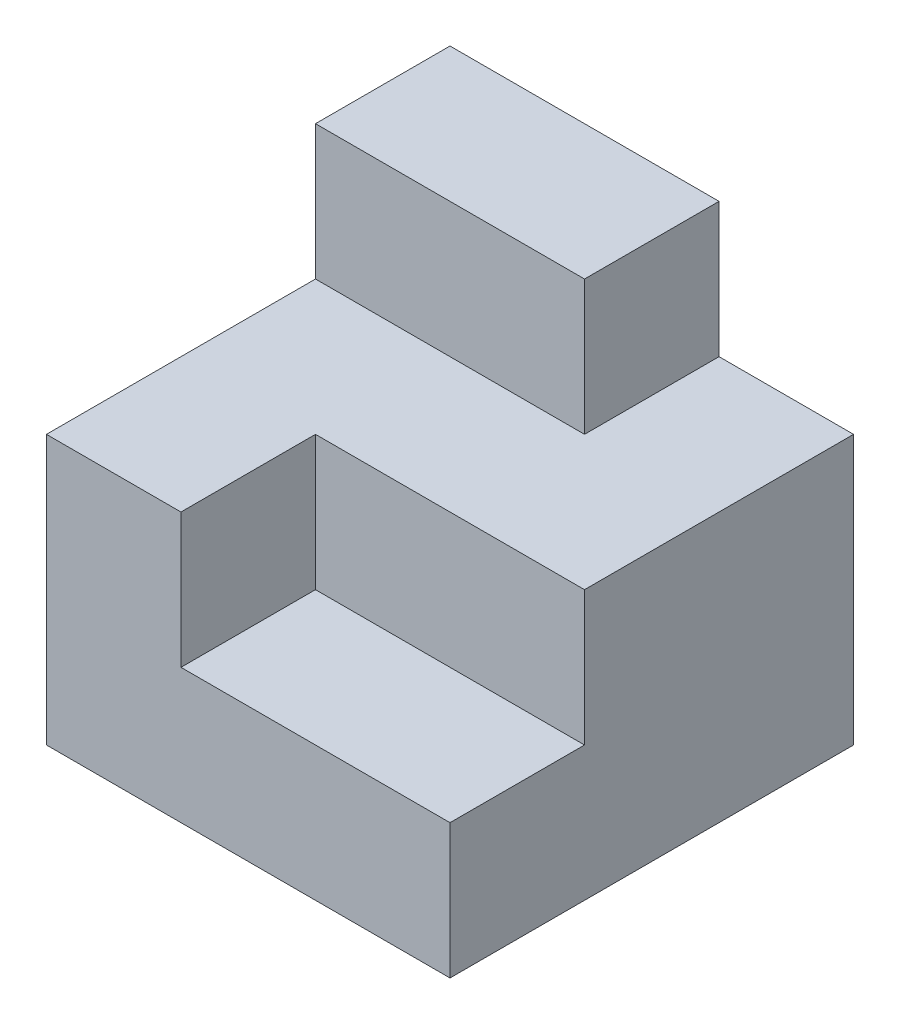
ISO-10303-21;
HEADER;
FILE_DESCRIPTION(('STEP AP214'),'2;1');
FILE_NAME('part.step','',(''),(''),'','','');
FILE_SCHEMA(('AUTOMOTIVE_DESIGN { 1 0 10303 214 1 1 1 1 }'));
ENDSEC;
DATA;
#1=APPLICATION_CONTEXT('core data for automotive mechanical design processes');
#2=APPLICATION_PROTOCOL_DEFINITION('international standard','automotive_design',2000,#1);
#3=PRODUCT_CONTEXT('',#1,'mechanical');
#4=PRODUCT('Part','Part','',(#3));
#5=PRODUCT_RELATED_PRODUCT_CATEGORY('part','',(#4));
#6=PRODUCT_DEFINITION_FORMATION('','',#4);
#7=PRODUCT_DEFINITION_CONTEXT('part definition',#1,'design');
#8=PRODUCT_DEFINITION('design','',#6,#7);
#9=PRODUCT_DEFINITION_SHAPE('','',#8);
#10=(LENGTH_UNIT() NAMED_UNIT(*) SI_UNIT(.MILLI.,.METRE.));
#11=(NAMED_UNIT(*) PLANE_ANGLE_UNIT() SI_UNIT($,.RADIAN.));
#12=(NAMED_UNIT(*) SI_UNIT($,.STERADIAN.) SOLID_ANGLE_UNIT());
#13=UNCERTAINTY_MEASURE_WITH_UNIT(LENGTH_MEASURE(1.E-05),#10,'distance_accuracy_value','');
#14=(GEOMETRIC_REPRESENTATION_CONTEXT(3) GLOBAL_UNCERTAINTY_ASSIGNED_CONTEXT((#13)) GLOBAL_UNIT_ASSIGNED_CONTEXT((#10,
#11,#12)) REPRESENTATION_CONTEXT('',''));
#15=CARTESIAN_POINT('',(0.,0.,0.));
#16=DIRECTION('',(0.,0.,1.));
#17=DIRECTION('',(1.,0.,0.));
#18=AXIS2_PLACEMENT_3D('',#15,#16,#17);
#19=CARTESIAN_POINT('',(-116.786127258445,10.,-29.9771877454831));
#20=DIRECTION('',(1.,0.,0.));
#21=DIRECTION('',(0.,0.,-1.));
#22=AXIS2_PLACEMENT_3D('',#19,#20,#21);
#23=PLANE('',#22);
#24=DIRECTION('',(0.,0.,1.));
#25=VECTOR('',#24,1.);
#26=CARTESIAN_POINT('',(-116.786127258445,0.,-29.9771877454831));
#27=LINE('',#26,#25);
#28=CARTESIAN_POINT('',(-116.786127258445,0.,-29.9771877454831));
#29=VERTEX_POINT('',#28);
#30=CARTESIAN_POINT('',(-116.786127258445,0.,0.0228122545168855));
#31=VERTEX_POINT('',#30);
#32=EDGE_CURVE('E191',#29,#31,#27,.T.);
#33=ORIENTED_EDGE('',*,*,#32,.T.);
#34=DIRECTION('',(0.,-1.,0.));
#35=VECTOR('',#34,1.);
#36=CARTESIAN_POINT('',(-116.786127258445,10.,0.0228122545168855));
#37=LINE('',#36,#35);
#38=CARTESIAN_POINT('',(-116.786127258445,20.,0.0228122545168851));
#39=VERTEX_POINT('',#38);
#40=EDGE_CURVE('E11',#39,#31,#37,.T.);
#41=ORIENTED_EDGE('',*,*,#40,.F.);
#42=DIRECTION('',(0.,0.,1.));
#43=VECTOR('',#42,1.);
#44=CARTESIAN_POINT('',(-116.786127258445,20.,-29.9771877454831));
#45=LINE('',#44,#43);
#46=CARTESIAN_POINT('',(-116.786127258445,20.,-19.9771877454831));
#47=VERTEX_POINT('',#46);
#48=EDGE_CURVE('E147',#47,#39,#45,.T.);
#49=ORIENTED_EDGE('',*,*,#48,.F.);
#50=DIRECTION('',(0.,-1.,0.));
#51=VECTOR('',#50,1.);
#52=CARTESIAN_POINT('',(-116.786127258445,30.,-19.9771877454831));
#53=LINE('',#52,#51);
#54=CARTESIAN_POINT('',(-116.786127258445,30.,-19.9771877454831));
#55=VERTEX_POINT('',#54);
#56=EDGE_CURVE('E126',#55,#47,#53,.T.);
#57=ORIENTED_EDGE('',*,*,#56,.F.);
#58=DIRECTION('',(0.,0.,1.));
#59=VECTOR('',#58,1.);
#60=CARTESIAN_POINT('',(-116.786127258445,30.,-29.9771877454831));
#61=LINE('',#60,#59);
#62=CARTESIAN_POINT('',(-116.786127258445,30.,-29.9771877454831));
#63=VERTEX_POINT('',#62);
#64=EDGE_CURVE('E133',#63,#55,#61,.T.);
#65=ORIENTED_EDGE('',*,*,#64,.F.);
#66=DIRECTION('',(0.,-1.,0.));
#67=VECTOR('',#66,1.);
#68=CARTESIAN_POINT('',(-116.786127258445,10.,-29.9771877454831));
#69=LINE('',#68,#67);
#70=EDGE_CURVE('E199',#63,#29,#69,.T.);
#71=ORIENTED_EDGE('',*,*,#70,.T.);
#72=EDGE_LOOP('',(#33,#41,#49,#57,#65,#71));
#73=FACE_BOUND('',#72,.T.);
#74=ADVANCED_FACE('F45',(#73),#23,.F.);
#75=CARTESIAN_POINT('',(-116.786127258445,10.,0.0228122545168855));
#76=DIRECTION('',(0.,0.,-1.));
#77=DIRECTION('',(-1.,0.,0.));
#78=AXIS2_PLACEMENT_3D('',#75,#76,#77);
#79=PLANE('',#78);
#80=DIRECTION('',(1.,0.,0.));
#81=VECTOR('',#80,1.);
#82=CARTESIAN_POINT('',(-116.786127258445,0.,0.0228122545168855));
#83=LINE('',#82,#81);
#84=CARTESIAN_POINT('',(-86.7861272584446,0.,0.0228122545168838));
#85=VERTEX_POINT('',#84);
#86=EDGE_CURVE('E202',#31,#85,#83,.T.);
#87=ORIENTED_EDGE('',*,*,#86,.T.);
#88=DIRECTION('',(0.,-1.,0.));
#89=VECTOR('',#88,1.);
#90=CARTESIAN_POINT('',(-86.7861272584446,10.,0.0228122545168838));
#91=LINE('',#90,#89);
#92=CARTESIAN_POINT('',(-86.7861272584446,10.,0.0228122545168838));
#93=VERTEX_POINT('',#92);
#94=EDGE_CURVE('E53',#93,#85,#91,.T.);
#95=ORIENTED_EDGE('',*,*,#94,.F.);
#96=DIRECTION('',(1.,0.,0.));
#97=VECTOR('',#96,1.);
#98=CARTESIAN_POINT('',(-116.786127258445,10.,0.0228122545168855));
#99=LINE('',#98,#97);
#100=CARTESIAN_POINT('',(-106.786127258445,10.,0.0228122545168849));
#101=VERTEX_POINT('',#100);
#102=EDGE_CURVE('E192',#101,#93,#99,.T.);
#103=ORIENTED_EDGE('',*,*,#102,.F.);
#104=DIRECTION('',(0.,-1.,0.));
#105=VECTOR('',#104,1.);
#106=CARTESIAN_POINT('',(-106.786127258445,20.,0.0228122545168838));
#107=LINE('',#106,#105);
#108=CARTESIAN_POINT('',(-106.786127258445,20.,0.0228122545168838));
#109=VERTEX_POINT('',#108);
#110=EDGE_CURVE('E187',#109,#101,#107,.T.);
#111=ORIENTED_EDGE('',*,*,#110,.F.);
#112=DIRECTION('',(1.,0.,0.));
#113=VECTOR('',#112,1.);
#114=CARTESIAN_POINT('',(-116.786127258445,20.,0.0228122545168851));
#115=LINE('',#114,#113);
#116=EDGE_CURVE('E162',#39,#109,#115,.T.);
#117=ORIENTED_EDGE('',*,*,#116,.F.);
#118=ORIENTED_EDGE('',*,*,#40,.T.);
#119=EDGE_LOOP('',(#87,#95,#103,#111,#117,#118));
#120=FACE_BOUND('',#119,.T.);
#121=ADVANCED_FACE('F232',(#120),#79,.F.);
#122=CARTESIAN_POINT('',(-86.7861272584446,10.,-29.9771877454831));
#123=DIRECTION('',(-1.,0.,0.));
#124=DIRECTION('',(0.,0.,1.));
#125=AXIS2_PLACEMENT_3D('',#122,#123,#124);
#126=PLANE('',#125);
#127=DIRECTION('',(0.,0.,-1.));
#128=VECTOR('',#127,1.);
#129=CARTESIAN_POINT('',(-86.7861272584446,0.,-29.9771877454831));
#130=LINE('',#129,#128);
#131=CARTESIAN_POINT('',(-86.7861272584446,0.,-29.9771877454831));
#132=VERTEX_POINT('',#131);
#133=EDGE_CURVE('E205',#85,#132,#130,.T.);
#134=ORIENTED_EDGE('',*,*,#133,.T.);
#135=DIRECTION('',(0.,-1.,0.));
#136=VECTOR('',#135,1.);
#137=CARTESIAN_POINT('',(-86.7861272584446,10.,-29.9771877454831));
#138=LINE('',#137,#136);
#139=CARTESIAN_POINT('',(-86.7861272584446,20.,-29.9771877454831));
#140=VERTEX_POINT('',#139);
#141=EDGE_CURVE('E212',#140,#132,#138,.T.);
#142=ORIENTED_EDGE('',*,*,#141,.F.);
#143=DIRECTION('',(0.,0.,-1.));
#144=VECTOR('',#143,1.);
#145=CARTESIAN_POINT('',(-86.7861272584446,20.,-29.9771877454831));
#146=LINE('',#145,#144);
#147=CARTESIAN_POINT('',(-86.7861272584446,20.,-9.97718774548311));
#148=VERTEX_POINT('',#147);
#149=EDGE_CURVE('E171',#148,#140,#146,.T.);
#150=ORIENTED_EDGE('',*,*,#149,.F.);
#151=DIRECTION('',(0.,-1.,0.));
#152=VECTOR('',#151,1.);
#153=CARTESIAN_POINT('',(-86.7861272584446,20.,-9.97718774548311));
#154=LINE('',#153,#152);
#155=CARTESIAN_POINT('',(-86.7861272584446,10.,-9.97718774548311));
#156=VERTEX_POINT('',#155);
#157=EDGE_CURVE('E175',#148,#156,#154,.T.);
#158=ORIENTED_EDGE('',*,*,#157,.T.);
#159=DIRECTION('',(0.,0.,-1.));
#160=VECTOR('',#159,1.);
#161=CARTESIAN_POINT('',(-86.7861272584446,10.,-29.9771877454831));
#162=LINE('',#161,#160);
#163=EDGE_CURVE('E195',#93,#156,#162,.T.);
#164=ORIENTED_EDGE('',*,*,#163,.F.);
#165=ORIENTED_EDGE('',*,*,#94,.T.);
#166=EDGE_LOOP('',(#134,#142,#150,#158,#164,#165));
#167=FACE_BOUND('',#166,.T.);
#168=ADVANCED_FACE('F221',(#167),#126,.F.);
#169=CARTESIAN_POINT('',(-116.786127258445,10.,-29.9771877454831));
#170=DIRECTION('',(0.,0.,1.));
#171=DIRECTION('',(1.,0.,0.));
#172=AXIS2_PLACEMENT_3D('',#169,#170,#171);
#173=PLANE('',#172);
#174=DIRECTION('',(-1.,0.,0.));
#175=VECTOR('',#174,1.);
#176=CARTESIAN_POINT('',(-116.786127258445,0.,-29.9771877454831));
#177=LINE('',#176,#175);
#178=EDGE_CURVE('E196',#132,#29,#177,.T.);
#179=ORIENTED_EDGE('',*,*,#178,.T.);
#180=ORIENTED_EDGE('',*,*,#70,.F.);
#181=DIRECTION('',(-1.,0.,0.));
#182=VECTOR('',#181,1.);
#183=CARTESIAN_POINT('',(-116.786127258445,30.,-29.9771877454831));
#184=LINE('',#183,#182);
#185=CARTESIAN_POINT('',(-96.7861272584446,30.,-29.9771877454831));
#186=VERTEX_POINT('',#185);
#187=EDGE_CURVE('E139',#186,#63,#184,.T.);
#188=ORIENTED_EDGE('',*,*,#187,.F.);
#189=DIRECTION('',(0.,-1.,0.));
#190=VECTOR('',#189,1.);
#191=CARTESIAN_POINT('',(-96.7861272584446,30.,-29.9771877454831));
#192=LINE('',#191,#190);
#193=CARTESIAN_POINT('',(-96.7861272584446,20.,-29.9771877454831));
#194=VERTEX_POINT('',#193);
#195=EDGE_CURVE('E156',#186,#194,#192,.T.);
#196=ORIENTED_EDGE('',*,*,#195,.T.);
#197=DIRECTION('',(-1.,0.,0.));
#198=VECTOR('',#197,1.);
#199=CARTESIAN_POINT('',(-106.786127258445,20.,-29.9771877454831));
#200=LINE('',#199,#198);
#201=EDGE_CURVE('E60',#140,#194,#200,.T.);
#202=ORIENTED_EDGE('',*,*,#201,.F.);
#203=ORIENTED_EDGE('',*,*,#141,.T.);
#204=EDGE_LOOP('',(#179,#180,#188,#196,#202,#203));
#205=FACE_BOUND('',#204,.T.);
#206=ADVANCED_FACE('F229',(#205),#173,.F.);
#207=CARTESIAN_POINT('',(0.,10.,0.));
#208=DIRECTION('',(0.,1.,0.));
#209=DIRECTION('',(0.,0.,1.));
#210=AXIS2_PLACEMENT_3D('',#207,#208,#209);
#211=PLANE('',#210);
#212=DIRECTION('',(1.,0.,0.));
#213=VECTOR('',#212,1.);
#214=CARTESIAN_POINT('',(-86.7861272584446,10.,-9.97718774548311));
#215=LINE('',#214,#213);
#216=CARTESIAN_POINT('',(-106.786127258445,10.,-9.97718774548311));
#217=VERTEX_POINT('',#216);
#218=EDGE_CURVE('E154',#217,#156,#215,.T.);
#219=ORIENTED_EDGE('',*,*,#218,.F.);
#220=DIRECTION('',(0.,0.,-1.));
#221=VECTOR('',#220,1.);
#222=CARTESIAN_POINT('',(-106.786127258445,10.,-9.97718774548311));
#223=LINE('',#222,#221);
#224=EDGE_CURVE('E149',#101,#217,#223,.T.);
#225=ORIENTED_EDGE('',*,*,#224,.F.);
#226=ORIENTED_EDGE('',*,*,#102,.T.);
#227=ORIENTED_EDGE('',*,*,#163,.T.);
#228=EDGE_LOOP('',(#219,#225,#226,#227));
#229=FACE_BOUND('',#228,.T.);
#230=ADVANCED_FACE('F275',(#229),#211,.T.);
#231=CARTESIAN_POINT('',(0.,0.,0.));
#232=DIRECTION('',(0.,1.,0.));
#233=DIRECTION('',(0.,0.,1.));
#234=AXIS2_PLACEMENT_3D('',#231,#232,#233);
#235=PLANE('',#234);
#236=ORIENTED_EDGE('',*,*,#32,.F.);
#237=ORIENTED_EDGE('',*,*,#178,.F.);
#238=ORIENTED_EDGE('',*,*,#133,.F.);
#239=ORIENTED_EDGE('',*,*,#86,.F.);
#240=EDGE_LOOP('',(#236,#237,#238,#239));
#241=FACE_BOUND('',#240,.T.);
#242=ADVANCED_FACE('F227',(#241),#235,.F.);
#243=CARTESIAN_POINT('',(-106.786127258445,20.,-9.97718774548311));
#244=DIRECTION('',(-1.,0.,0.));
#245=DIRECTION('',(0.,0.,1.));
#246=AXIS2_PLACEMENT_3D('',#243,#244,#245);
#247=PLANE('',#246);
#248=ORIENTED_EDGE('',*,*,#224,.T.);
#249=DIRECTION('',(0.,-1.,0.));
#250=VECTOR('',#249,1.);
#251=CARTESIAN_POINT('',(-106.786127258445,20.,-9.97718774548311));
#252=LINE('',#251,#250);
#253=CARTESIAN_POINT('',(-106.786127258445,20.,-9.97718774548311));
#254=VERTEX_POINT('',#253);
#255=EDGE_CURVE('E183',#254,#217,#252,.T.);
#256=ORIENTED_EDGE('',*,*,#255,.F.);
#257=DIRECTION('',(0.,0.,-1.));
#258=VECTOR('',#257,1.);
#259=CARTESIAN_POINT('',(-106.786127258445,20.,-9.97718774548311));
#260=LINE('',#259,#258);
#261=EDGE_CURVE('E165',#109,#254,#260,.T.);
#262=ORIENTED_EDGE('',*,*,#261,.F.);
#263=ORIENTED_EDGE('',*,*,#110,.T.);
#264=EDGE_LOOP('',(#248,#256,#262,#263));
#265=FACE_BOUND('',#264,.T.);
#266=ADVANCED_FACE('F239',(#265),#247,.F.);
#267=CARTESIAN_POINT('',(-86.7861272584446,20.,-9.97718774548311));
#268=DIRECTION('',(0.,0.,-1.));
#269=DIRECTION('',(-1.,0.,0.));
#270=AXIS2_PLACEMENT_3D('',#267,#268,#269);
#271=PLANE('',#270);
#272=ORIENTED_EDGE('',*,*,#218,.T.);
#273=ORIENTED_EDGE('',*,*,#157,.F.);
#274=DIRECTION('',(1.,0.,0.));
#275=VECTOR('',#274,1.);
#276=CARTESIAN_POINT('',(-86.7861272584446,20.,-9.97718774548311));
#277=LINE('',#276,#275);
#278=EDGE_CURVE('E168',#254,#148,#277,.T.);
#279=ORIENTED_EDGE('',*,*,#278,.F.);
#280=ORIENTED_EDGE('',*,*,#255,.T.);
#281=EDGE_LOOP('',(#272,#273,#279,#280));
#282=FACE_BOUND('',#281,.T.);
#283=ADVANCED_FACE('F241',(#282),#271,.F.);
#284=CARTESIAN_POINT('',(0.,20.,0.));
#285=DIRECTION('',(0.,1.,0.));
#286=DIRECTION('',(0.,0.,1.));
#287=AXIS2_PLACEMENT_3D('',#284,#285,#286);
#288=PLANE('',#287);
#289=DIRECTION('',(0.,0.,-1.));
#290=VECTOR('',#289,1.);
#291=CARTESIAN_POINT('',(-96.7861272584446,20.,-29.9771877454831));
#292=LINE('',#291,#290);
#293=CARTESIAN_POINT('',(-96.7861272584446,20.,-19.9771877454831));
#294=VERTEX_POINT('',#293);
#295=EDGE_CURVE('E143',#294,#194,#292,.T.);
#296=ORIENTED_EDGE('',*,*,#295,.F.);
#297=DIRECTION('',(1.,0.,0.));
#298=VECTOR('',#297,1.);
#299=CARTESIAN_POINT('',(-116.786127258445,20.,-19.9771877454831));
#300=LINE('',#299,#298);
#301=EDGE_CURVE('E66',#47,#294,#300,.T.);
#302=ORIENTED_EDGE('',*,*,#301,.F.);
#303=ORIENTED_EDGE('',*,*,#48,.T.);
#304=ORIENTED_EDGE('',*,*,#116,.T.);
#305=ORIENTED_EDGE('',*,*,#261,.T.);
#306=ORIENTED_EDGE('',*,*,#278,.T.);
#307=ORIENTED_EDGE('',*,*,#149,.T.);
#308=ORIENTED_EDGE('',*,*,#201,.T.);
#309=EDGE_LOOP('',(#296,#302,#303,#304,#305,#306,#307,#308));
#310=FACE_BOUND('',#309,.T.);
#311=ADVANCED_FACE('F234',(#310),#288,.T.);
#312=CARTESIAN_POINT('',(-116.786127258445,30.,-19.9771877454831));
#313=DIRECTION('',(0.,0.,-1.));
#314=DIRECTION('',(-1.,0.,0.));
#315=AXIS2_PLACEMENT_3D('',#312,#313,#314);
#316=PLANE('',#315);
#317=ORIENTED_EDGE('',*,*,#301,.T.);
#318=DIRECTION('',(0.,-1.,0.));
#319=VECTOR('',#318,1.);
#320=CARTESIAN_POINT('',(-96.7861272584446,30.,-19.9771877454831));
#321=LINE('',#320,#319);
#322=CARTESIAN_POINT('',(-96.7861272584446,30.,-19.9771877454831));
#323=VERTEX_POINT('',#322);
#324=EDGE_CURVE('E128',#323,#294,#321,.T.);
#325=ORIENTED_EDGE('',*,*,#324,.F.);
#326=DIRECTION('',(1.,0.,0.));
#327=VECTOR('',#326,1.);
#328=CARTESIAN_POINT('',(-116.786127258445,30.,-19.9771877454831));
#329=LINE('',#328,#327);
#330=EDGE_CURVE('E122',#55,#323,#329,.T.);
#331=ORIENTED_EDGE('',*,*,#330,.F.);
#332=ORIENTED_EDGE('',*,*,#56,.T.);
#333=EDGE_LOOP('',(#317,#325,#331,#332));
#334=FACE_BOUND('',#333,.T.);
#335=ADVANCED_FACE('F124',(#334),#316,.F.);
#336=CARTESIAN_POINT('',(-96.7861272584446,30.,-29.9771877454831));
#337=DIRECTION('',(-1.,0.,0.));
#338=DIRECTION('',(0.,0.,1.));
#339=AXIS2_PLACEMENT_3D('',#336,#337,#338);
#340=PLANE('',#339);
#341=ORIENTED_EDGE('',*,*,#295,.T.);
#342=ORIENTED_EDGE('',*,*,#195,.F.);
#343=DIRECTION('',(0.,0.,-1.));
#344=VECTOR('',#343,1.);
#345=CARTESIAN_POINT('',(-96.7861272584446,30.,-29.9771877454831));
#346=LINE('',#345,#344);
#347=EDGE_CURVE('E132',#323,#186,#346,.T.);
#348=ORIENTED_EDGE('',*,*,#347,.F.);
#349=ORIENTED_EDGE('',*,*,#324,.T.);
#350=EDGE_LOOP('',(#341,#342,#348,#349));
#351=FACE_BOUND('',#350,.T.);
#352=ADVANCED_FACE('F255',(#351),#340,.F.);
#353=CARTESIAN_POINT('',(0.,30.,0.));
#354=DIRECTION('',(0.,1.,0.));
#355=DIRECTION('',(0.,0.,1.));
#356=AXIS2_PLACEMENT_3D('',#353,#354,#355);
#357=PLANE('',#356);
#358=ORIENTED_EDGE('',*,*,#64,.T.);
#359=ORIENTED_EDGE('',*,*,#330,.T.);
#360=ORIENTED_EDGE('',*,*,#347,.T.);
#361=ORIENTED_EDGE('',*,*,#187,.T.);
#362=EDGE_LOOP('',(#358,#359,#360,#361));
#363=FACE_BOUND('',#362,.T.);
#364=ADVANCED_FACE('F137',(#363),#357,.T.);
#365=CLOSED_SHELL('',(#74,#121,#168,#206,#230,#242,#266,#283,#311,#335,#352,#364));
#366=MANIFOLD_SOLID_BREP('B2',#365);
#367=ADVANCED_BREP_SHAPE_REPRESENTATION('',(#18,#366),#14);
#368=SHAPE_DEFINITION_REPRESENTATION(#9,#367);
ENDSEC;
END-ISO-10303-21;
